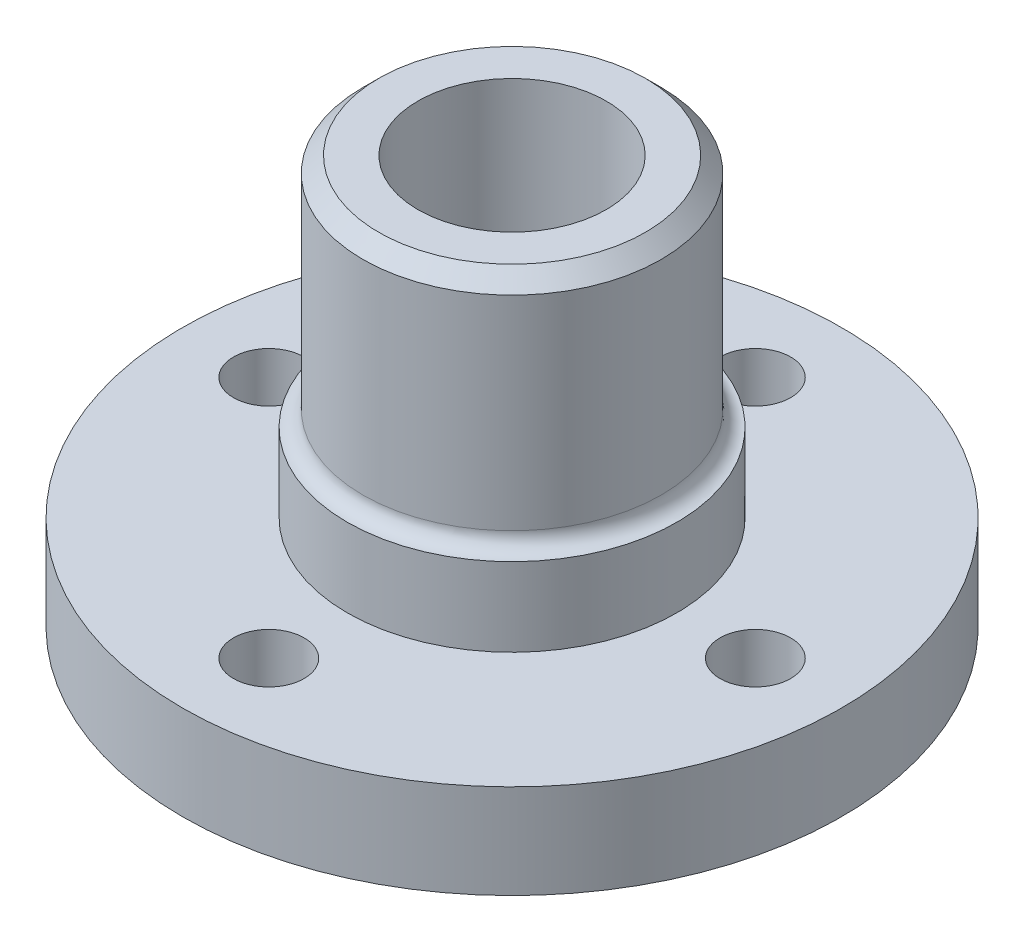
ISO-10303-21;
HEADER;
FILE_DESCRIPTION(('STEP AP214'),'2;1');
FILE_NAME('part.step','',(''),(''),'','','');
FILE_SCHEMA(('AUTOMOTIVE_DESIGN { 1 0 10303 214 1 1 1 1 }'));
ENDSEC;
DATA;
#1=APPLICATION_CONTEXT('core data for automotive mechanical design processes');
#2=APPLICATION_PROTOCOL_DEFINITION('international standard','automotive_design',2000,#1);
#3=PRODUCT_CONTEXT('',#1,'mechanical');
#4=PRODUCT('Part','Part','',(#3));
#5=PRODUCT_RELATED_PRODUCT_CATEGORY('part','',(#4));
#6=PRODUCT_DEFINITION_FORMATION('','',#4);
#7=PRODUCT_DEFINITION_CONTEXT('part definition',#1,'design');
#8=PRODUCT_DEFINITION('design','',#6,#7);
#9=PRODUCT_DEFINITION_SHAPE('','',#8);
#10=(LENGTH_UNIT() NAMED_UNIT(*) SI_UNIT(.MILLI.,.METRE.));
#11=(NAMED_UNIT(*) PLANE_ANGLE_UNIT() SI_UNIT($,.RADIAN.));
#12=(NAMED_UNIT(*) SI_UNIT($,.STERADIAN.) SOLID_ANGLE_UNIT());
#13=UNCERTAINTY_MEASURE_WITH_UNIT(LENGTH_MEASURE(1.E-05),#10,'distance_accuracy_value','');
#14=(GEOMETRIC_REPRESENTATION_CONTEXT(3) GLOBAL_UNCERTAINTY_ASSIGNED_CONTEXT((#13)) GLOBAL_UNIT_ASSIGNED_CONTEXT((#10,
#11,#12)) REPRESENTATION_CONTEXT('',''));
#15=CARTESIAN_POINT('',(0.,0.,0.));
#16=DIRECTION('',(0.,0.,1.));
#17=DIRECTION('',(1.,0.,0.));
#18=AXIS2_PLACEMENT_3D('',#15,#16,#17);
#19=CARTESIAN_POINT('',(0.,7.,0.));
#20=DIRECTION('',(0.,1.,0.));
#21=DIRECTION('',(0.,0.,1.));
#22=AXIS2_PLACEMENT_3D('',#19,#20,#21);
#23=PLANE('',#22);
#24=CARTESIAN_POINT('',(0.,7.,-15.5));
#25=DIRECTION('',(0.,1.,0.));
#26=DIRECTION('',(0.,0.,1.));
#27=AXIS2_PLACEMENT_3D('',#24,#25,#26);
#28=CIRCLE('',#27,2.25);
#29=CARTESIAN_POINT('',(0.,7.,-13.25));
#30=VERTEX_POINT('',#29);
#31=EDGE_CURVE('E62',#30,#30,#28,.T.);
#32=ORIENTED_EDGE('',*,*,#31,.F.);
#33=EDGE_LOOP('',(#32));
#34=FACE_BOUND('',#33,.T.);
#35=CARTESIAN_POINT('',(0.,7.,15.5));
#36=DIRECTION('',(0.,1.,0.));
#37=DIRECTION('',(0.,0.,1.));
#38=AXIS2_PLACEMENT_3D('',#35,#36,#37);
#39=CIRCLE('',#38,2.25);
#40=CARTESIAN_POINT('',(0.,7.,17.75));
#41=VERTEX_POINT('',#40);
#42=EDGE_CURVE('E174',#41,#41,#39,.F.);
#43=ORIENTED_EDGE('',*,*,#42,.T.);
#44=EDGE_LOOP('',(#43));
#45=FACE_BOUND('',#44,.T.);
#46=CARTESIAN_POINT('',(-15.5,7.,0.));
#47=DIRECTION('',(0.,1.,0.));
#48=DIRECTION('',(0.,0.,1.));
#49=AXIS2_PLACEMENT_3D('',#46,#47,#48);
#50=CIRCLE('',#49,2.25);
#51=CARTESIAN_POINT('',(-15.5,7.,2.25000000000001));
#52=VERTEX_POINT('',#51);
#53=EDGE_CURVE('E81',#52,#52,#50,.T.);
#54=ORIENTED_EDGE('',*,*,#53,.F.);
#55=EDGE_LOOP('',(#54));
#56=FACE_BOUND('',#55,.T.);
#57=CARTESIAN_POINT('',(0.,7.,0.));
#58=DIRECTION('',(0.,1.,0.));
#59=DIRECTION('',(0.,0.,1.));
#60=AXIS2_PLACEMENT_3D('',#57,#58,#59);
#61=CIRCLE('',#60,21.);
#62=CARTESIAN_POINT('',(0.,7.,21.));
#63=VERTEX_POINT('',#62);
#64=EDGE_CURVE('E69',#63,#63,#61,.T.);
#65=ORIENTED_EDGE('',*,*,#64,.T.);
#66=EDGE_LOOP('',(#65));
#67=FACE_BOUND('',#66,.T.);
#68=CARTESIAN_POINT('',(0.,7.,0.));
#69=DIRECTION('',(0.,1.,0.));
#70=DIRECTION('',(0.,0.,1.));
#71=AXIS2_PLACEMENT_3D('',#68,#69,#70);
#72=CIRCLE('',#71,10.5);
#73=CARTESIAN_POINT('',(0.,7.,10.5));
#74=VERTEX_POINT('',#73);
#75=EDGE_CURVE('E95',#74,#74,#72,.T.);
#76=ORIENTED_EDGE('',*,*,#75,.F.);
#77=EDGE_LOOP('',(#76));
#78=FACE_BOUND('',#77,.T.);
#79=CARTESIAN_POINT('',(15.5,7.,0.));
#80=DIRECTION('',(0.,1.,0.));
#81=DIRECTION('',(0.,0.,1.));
#82=AXIS2_PLACEMENT_3D('',#79,#80,#81);
#83=CIRCLE('',#82,2.25);
#84=CARTESIAN_POINT('',(15.5,7.,2.24999999999999));
#85=VERTEX_POINT('',#84);
#86=EDGE_CURVE('E171',#85,#85,#83,.F.);
#87=ORIENTED_EDGE('',*,*,#86,.T.);
#88=EDGE_LOOP('',(#87));
#89=FACE_BOUND('',#88,.T.);
#90=ADVANCED_FACE('F41',(#34,#45,#56,#67,#78,#89),#23,.T.);
#91=CARTESIAN_POINT('',(0.,0.999999999999999,0.));
#92=DIRECTION('',(0.,1.,0.));
#93=DIRECTION('',(0.,0.,1.));
#94=AXIS2_PLACEMENT_3D('',#91,#92,#93);
#95=PLANE('',#94);
#96=CARTESIAN_POINT('',(0.,0.999999999999999,-15.5));
#97=DIRECTION('',(0.,1.,0.));
#98=DIRECTION('',(0.,0.,1.));
#99=AXIS2_PLACEMENT_3D('',#96,#97,#98);
#100=CIRCLE('',#99,2.25);
#101=CARTESIAN_POINT('',(0.,0.999999999999999,-13.25));
#102=VERTEX_POINT('',#101);
#103=EDGE_CURVE('E45',#102,#102,#100,.T.);
#104=ORIENTED_EDGE('',*,*,#103,.T.);
#105=EDGE_LOOP('',(#104));
#106=FACE_BOUND('',#105,.T.);
#107=CARTESIAN_POINT('',(-15.5,0.999999999999999,0.));
#108=DIRECTION('',(0.,1.,0.));
#109=DIRECTION('',(0.,0.,1.));
#110=AXIS2_PLACEMENT_3D('',#107,#108,#109);
#111=CIRCLE('',#110,2.25);
#112=CARTESIAN_POINT('',(-15.5,0.999999999999999,2.25000000000001));
#113=VERTEX_POINT('',#112);
#114=EDGE_CURVE('E58',#113,#113,#111,.T.);
#115=ORIENTED_EDGE('',*,*,#114,.T.);
#116=EDGE_LOOP('',(#115));
#117=FACE_BOUND('',#116,.T.);
#118=CARTESIAN_POINT('',(0.,0.999999999999999,0.));
#119=DIRECTION('',(0.,1.,0.));
#120=DIRECTION('',(0.,0.,1.));
#121=AXIS2_PLACEMENT_3D('',#118,#119,#120);
#122=CIRCLE('',#121,11.);
#123=CARTESIAN_POINT('',(0.,0.999999999999999,11.));
#124=VERTEX_POINT('',#123);
#125=EDGE_CURVE('E10',#124,#124,#122,.T.);
#126=ORIENTED_EDGE('',*,*,#125,.T.);
#127=EDGE_LOOP('',(#126));
#128=FACE_BOUND('',#127,.T.);
#129=CARTESIAN_POINT('',(0.,1.,0.));
#130=DIRECTION('',(0.,1.,0.));
#131=DIRECTION('',(0.,0.,1.));
#132=AXIS2_PLACEMENT_3D('',#129,#130,#131);
#133=CIRCLE('',#132,21.);
#134=CARTESIAN_POINT('',(0.,1.,21.));
#135=VERTEX_POINT('',#134);
#136=EDGE_CURVE('E73',#135,#135,#133,.T.);
#137=ORIENTED_EDGE('',*,*,#136,.F.);
#138=EDGE_LOOP('',(#137));
#139=FACE_BOUND('',#138,.T.);
#140=CARTESIAN_POINT('',(0.,0.999999999999999,15.5));
#141=DIRECTION('',(0.,1.,0.));
#142=DIRECTION('',(0.,0.,1.));
#143=AXIS2_PLACEMENT_3D('',#140,#141,#142);
#144=CIRCLE('',#143,2.25);
#145=CARTESIAN_POINT('',(0.,0.999999999999999,17.75));
#146=VERTEX_POINT('',#145);
#147=EDGE_CURVE('E61',#146,#146,#144,.F.);
#148=ORIENTED_EDGE('',*,*,#147,.F.);
#149=EDGE_LOOP('',(#148));
#150=FACE_BOUND('',#149,.T.);
#151=CARTESIAN_POINT('',(15.5,0.999999999999999,0.));
#152=DIRECTION('',(0.,1.,0.));
#153=DIRECTION('',(0.,0.,1.));
#154=AXIS2_PLACEMENT_3D('',#151,#152,#153);
#155=CIRCLE('',#154,2.25);
#156=CARTESIAN_POINT('',(15.5,0.999999999999999,2.24999999999999));
#157=VERTEX_POINT('',#156);
#158=EDGE_CURVE('E64',#157,#157,#155,.F.);
#159=ORIENTED_EDGE('',*,*,#158,.F.);
#160=EDGE_LOOP('',(#159));
#161=FACE_BOUND('',#160,.T.);
#162=ADVANCED_FACE('F123',(#106,#117,#128,#139,#150,#161),#95,.F.);
#163=CARTESIAN_POINT('',(0.,27.,0.));
#164=DIRECTION('',(0.,1.,0.));
#165=DIRECTION('',(0.,0.,1.));
#166=AXIS2_PLACEMENT_3D('',#163,#164,#165);
#167=CYLINDRICAL_SURFACE('',#166,10.5);
#168=ORIENTED_EDGE('',*,*,#75,.T.);
#169=EDGE_LOOP('',(#168));
#170=FACE_BOUND('',#169,.T.);
#171=CARTESIAN_POINT('',(0.,12.,0.));
#172=DIRECTION('',(0.,1.,0.));
#173=DIRECTION('',(0.,0.,1.));
#174=AXIS2_PLACEMENT_3D('',#171,#172,#173);
#175=CIRCLE('',#174,10.5);
#176=CARTESIAN_POINT('',(0.,12.,10.5));
#177=VERTEX_POINT('',#176);
#178=EDGE_CURVE('E92',#177,#177,#175,.T.);
#179=ORIENTED_EDGE('',*,*,#178,.F.);
#180=EDGE_LOOP('',(#179));
#181=FACE_BOUND('',#180,.T.);
#182=ADVANCED_FACE('F129',(#170,#181),#167,.T.);
#183=CARTESIAN_POINT('',(0.,27.,0.));
#184=DIRECTION('',(0.,1.,0.));
#185=DIRECTION('',(0.,0.,1.));
#186=AXIS2_PLACEMENT_3D('',#183,#184,#185);
#187=CYLINDRICAL_SURFACE('',#186,9.5);
#188=CARTESIAN_POINT('',(0.,26.,0.));
#189=DIRECTION('',(0.,-1.,0.));
#190=DIRECTION('',(0.,0.,-1.));
#191=AXIS2_PLACEMENT_3D('',#188,#189,#190);
#192=CIRCLE('',#191,9.5);
#193=CARTESIAN_POINT('',(0.,26.,-9.5));
#194=VERTEX_POINT('',#193);
#195=EDGE_CURVE('E49',#194,#194,#192,.T.);
#196=ORIENTED_EDGE('',*,*,#195,.T.);
#197=EDGE_LOOP('',(#196));
#198=FACE_BOUND('',#197,.T.);
#199=CARTESIAN_POINT('',(0.,13.,0.));
#200=DIRECTION('',(0.,1.,0.));
#201=DIRECTION('',(0.,0.,1.));
#202=AXIS2_PLACEMENT_3D('',#199,#200,#201);
#203=CIRCLE('',#202,9.5);
#204=CARTESIAN_POINT('',(0.,13.,9.5));
#205=VERTEX_POINT('',#204);
#206=EDGE_CURVE('E98',#205,#205,#203,.T.);
#207=ORIENTED_EDGE('',*,*,#206,.T.);
#208=EDGE_LOOP('',(#207));
#209=FACE_BOUND('',#208,.T.);
#210=ADVANCED_FACE('F136',(#198,#209),#187,.T.);
#211=CARTESIAN_POINT('',(0.,27.,0.));
#212=DIRECTION('',(0.,-1.,0.));
#213=DIRECTION('',(0.,0.,-1.));
#214=AXIS2_PLACEMENT_3D('',#211,#212,#213);
#215=PLANE('',#214);
#216=CARTESIAN_POINT('',(0.,27.,0.));
#217=DIRECTION('',(0.,-1.,0.));
#218=DIRECTION('',(0.,0.,-1.));
#219=AXIS2_PLACEMENT_3D('',#216,#217,#218);
#220=CIRCLE('',#219,8.5);
#221=CARTESIAN_POINT('',(0.,27.,-8.5));
#222=VERTEX_POINT('',#221);
#223=EDGE_CURVE('E54',#222,#222,#220,.F.);
#224=ORIENTED_EDGE('',*,*,#223,.T.);
#225=EDGE_LOOP('',(#224));
#226=FACE_BOUND('',#225,.T.);
#227=CARTESIAN_POINT('',(0.,27.,0.));
#228=DIRECTION('',(0.,1.,0.));
#229=DIRECTION('',(0.,0.,1.));
#230=AXIS2_PLACEMENT_3D('',#227,#228,#229);
#231=CIRCLE('',#230,6.);
#232=CARTESIAN_POINT('',(0.,27.,6.));
#233=VERTEX_POINT('',#232);
#234=EDGE_CURVE('E89',#233,#233,#231,.T.);
#235=ORIENTED_EDGE('',*,*,#234,.F.);
#236=EDGE_LOOP('',(#235));
#237=FACE_BOUND('',#236,.T.);
#238=ADVANCED_FACE('F103',(#226,#237),#215,.F.);
#239=CARTESIAN_POINT('',(0.,27.,0.));
#240=DIRECTION('',(0.,1.,0.));
#241=DIRECTION('',(0.,0.,1.));
#242=AXIS2_PLACEMENT_3D('',#239,#240,#241);
#243=CYLINDRICAL_SURFACE('',#242,6.);
#244=CARTESIAN_POINT('',(0.,0.,0.));
#245=DIRECTION('',(0.,1.,0.));
#246=DIRECTION('',(0.,0.,1.));
#247=AXIS2_PLACEMENT_3D('',#244,#245,#246);
#248=CIRCLE('',#247,6.);
#249=CARTESIAN_POINT('',(0.,0.,6.));
#250=VERTEX_POINT('',#249);
#251=EDGE_CURVE('E86',#250,#250,#248,.T.);
#252=ORIENTED_EDGE('',*,*,#251,.F.);
#253=EDGE_LOOP('',(#252));
#254=FACE_BOUND('',#253,.T.);
#255=ORIENTED_EDGE('',*,*,#234,.T.);
#256=EDGE_LOOP('',(#255));
#257=FACE_BOUND('',#256,.T.);
#258=ADVANCED_FACE('F142',(#254,#257),#243,.F.);
#259=CARTESIAN_POINT('',(0.,0.,0.));
#260=DIRECTION('',(0.,1.,0.));
#261=DIRECTION('',(0.,0.,1.));
#262=AXIS2_PLACEMENT_3D('',#259,#260,#261);
#263=PLANE('',#262);
#264=CARTESIAN_POINT('',(0.,0.,0.));
#265=DIRECTION('',(0.,1.,0.));
#266=DIRECTION('',(0.,0.,1.));
#267=AXIS2_PLACEMENT_3D('',#264,#265,#266);
#268=CIRCLE('',#267,10.);
#269=CARTESIAN_POINT('',(0.,0.,10.));
#270=VERTEX_POINT('',#269);
#271=EDGE_CURVE('E78',#270,#270,#268,.T.);
#272=ORIENTED_EDGE('',*,*,#271,.F.);
#273=EDGE_LOOP('',(#272));
#274=FACE_BOUND('',#273,.T.);
#275=ORIENTED_EDGE('',*,*,#251,.T.);
#276=EDGE_LOOP('',(#275));
#277=FACE_BOUND('',#276,.T.);
#278=ADVANCED_FACE('F145',(#274,#277),#263,.F.);
#279=CARTESIAN_POINT('',(0.,27.,0.));
#280=DIRECTION('',(0.,1.,0.));
#281=DIRECTION('',(0.,0.,1.));
#282=AXIS2_PLACEMENT_3D('',#279,#280,#281);
#283=CYLINDRICAL_SURFACE('',#282,21.);
#284=ORIENTED_EDGE('',*,*,#64,.F.);
#285=EDGE_LOOP('',(#284));
#286=FACE_BOUND('',#285,.T.);
#287=ORIENTED_EDGE('',*,*,#136,.T.);
#288=EDGE_LOOP('',(#287));
#289=FACE_BOUND('',#288,.T.);
#290=ADVANCED_FACE('F117',(#286,#289),#283,.T.);
#291=CARTESIAN_POINT('',(0.,13.,0.));
#292=DIRECTION('',(0.,1.,0.));
#293=DIRECTION('',(0.,0.,1.));
#294=AXIS2_PLACEMENT_3D('',#291,#292,#293);
#295=TOROIDAL_SURFACE('',#294,10.5,1.);
#296=ORIENTED_EDGE('',*,*,#178,.T.);
#297=EDGE_LOOP('',(#296));
#298=FACE_BOUND('',#297,.T.);
#299=ORIENTED_EDGE('',*,*,#206,.F.);
#300=EDGE_LOOP('',(#299));
#301=FACE_BOUND('',#300,.T.);
#302=ADVANCED_FACE('F108',(#298,#301),#295,.F.);
#303=CARTESIAN_POINT('',(0.,27.,0.));
#304=DIRECTION('',(0.,-1.,0.));
#305=DIRECTION('',(0.,0.,-1.));
#306=AXIS2_PLACEMENT_3D('',#303,#304,#305);
#307=CONICAL_SURFACE('',#306,8.5,0.785398163397445);
#308=ORIENTED_EDGE('',*,*,#195,.F.);
#309=EDGE_LOOP('',(#308));
#310=FACE_BOUND('',#309,.T.);
#311=ORIENTED_EDGE('',*,*,#223,.F.);
#312=EDGE_LOOP('',(#311));
#313=FACE_BOUND('',#312,.T.);
#314=ADVANCED_FACE('F106',(#310,#313),#307,.T.);
#315=CARTESIAN_POINT('',(0.,0.,0.));
#316=DIRECTION('',(0.,1.,0.));
#317=DIRECTION('',(0.,0.,1.));
#318=AXIS2_PLACEMENT_3D('',#315,#316,#317);
#319=TOROIDAL_SURFACE('',#318,11.,1.);
#320=ORIENTED_EDGE('',*,*,#271,.T.);
#321=EDGE_LOOP('',(#320));
#322=FACE_BOUND('',#321,.T.);
#323=ORIENTED_EDGE('',*,*,#125,.F.);
#324=EDGE_LOOP('',(#323));
#325=FACE_BOUND('',#324,.T.);
#326=ADVANCED_FACE('F43',(#322,#325),#319,.F.);
#327=CARTESIAN_POINT('',(-15.5,0.,0.));
#328=DIRECTION('',(0.,1.,0.));
#329=DIRECTION('',(0.,0.,1.));
#330=AXIS2_PLACEMENT_3D('',#327,#328,#329);
#331=CYLINDRICAL_SURFACE('',#330,2.25);
#332=CARTESIAN_POINT('',(-15.5,7.,2.25000000000001));
#333=CARTESIAN_POINT('',(-15.5,6.9375,2.25000000000001));
#334=CARTESIAN_POINT('',(-15.5,6.875,2.25000000000001));
#335=CARTESIAN_POINT('',(-15.5,6.75,2.25000000000001));
#336=CARTESIAN_POINT('',(-15.5,6.6875,2.25000000000001));
#337=CARTESIAN_POINT('',(-15.5,6.5625,2.25000000000001));
#338=CARTESIAN_POINT('',(-15.5,6.5,2.25000000000001));
#339=CARTESIAN_POINT('',(-15.5,6.375,2.25000000000001));
#340=CARTESIAN_POINT('',(-15.5,6.3125,2.25000000000001));
#341=CARTESIAN_POINT('',(-15.5,6.1875,2.25000000000001));
#342=CARTESIAN_POINT('',(-15.5,6.125,2.25000000000001));
#343=CARTESIAN_POINT('',(-15.5,6.,2.25000000000001));
#344=CARTESIAN_POINT('',(-15.5,5.9375,2.25000000000001));
#345=CARTESIAN_POINT('',(-15.5,5.8125,2.25000000000001));
#346=CARTESIAN_POINT('',(-15.5,5.75,2.25000000000001));
#347=CARTESIAN_POINT('',(-15.5,5.625,2.25000000000001));
#348=CARTESIAN_POINT('',(-15.5,5.5625,2.25000000000001));
#349=CARTESIAN_POINT('',(-15.5,5.4375,2.25000000000001));
#350=CARTESIAN_POINT('',(-15.5,5.375,2.25000000000001));
#351=CARTESIAN_POINT('',(-15.5,5.25,2.25000000000001));
#352=CARTESIAN_POINT('',(-15.5,5.1875,2.25000000000001));
#353=CARTESIAN_POINT('',(-15.5,5.0625,2.25000000000001));
#354=CARTESIAN_POINT('',(-15.5,5.,2.25000000000001));
#355=CARTESIAN_POINT('',(-15.5,4.875,2.25000000000001));
#356=CARTESIAN_POINT('',(-15.5,4.8125,2.25000000000001));
#357=CARTESIAN_POINT('',(-15.5,4.6875,2.25000000000001));
#358=CARTESIAN_POINT('',(-15.5,4.625,2.25000000000001));
#359=CARTESIAN_POINT('',(-15.5,4.5,2.25000000000001));
#360=CARTESIAN_POINT('',(-15.5,4.4375,2.25000000000001));
#361=CARTESIAN_POINT('',(-15.5,4.3125,2.25000000000001));
#362=CARTESIAN_POINT('',(-15.5,4.25,2.25000000000001));
#363=CARTESIAN_POINT('',(-15.5,4.125,2.25000000000001));
#364=CARTESIAN_POINT('',(-15.5,4.0625,2.25000000000001));
#365=CARTESIAN_POINT('',(-15.5,3.9375,2.25000000000001));
#366=CARTESIAN_POINT('',(-15.5,3.875,2.25000000000001));
#367=CARTESIAN_POINT('',(-15.5,3.75,2.25000000000001));
#368=CARTESIAN_POINT('',(-15.5,3.6875,2.25000000000001));
#369=CARTESIAN_POINT('',(-15.5,3.5625,2.25000000000001));
#370=CARTESIAN_POINT('',(-15.5,3.5,2.25000000000001));
#371=CARTESIAN_POINT('',(-15.5,3.375,2.25000000000001));
#372=CARTESIAN_POINT('',(-15.5,3.3125,2.25000000000001));
#373=CARTESIAN_POINT('',(-15.5,3.1875,2.25000000000001));
#374=CARTESIAN_POINT('',(-15.5,3.125,2.25000000000001));
#375=CARTESIAN_POINT('',(-15.5,3.,2.25000000000001));
#376=CARTESIAN_POINT('',(-15.5,2.9375,2.25000000000001));
#377=CARTESIAN_POINT('',(-15.5,2.8125,2.25000000000001));
#378=CARTESIAN_POINT('',(-15.5,2.75,2.25000000000001));
#379=CARTESIAN_POINT('',(-15.5,2.625,2.25000000000001));
#380=CARTESIAN_POINT('',(-15.5,2.5625,2.25000000000001));
#381=CARTESIAN_POINT('',(-15.5,2.4375,2.25000000000001));
#382=CARTESIAN_POINT('',(-15.5,2.375,2.25000000000001));
#383=CARTESIAN_POINT('',(-15.5,2.25,2.25000000000001));
#384=CARTESIAN_POINT('',(-15.5,2.1875,2.25000000000001));
#385=CARTESIAN_POINT('',(-15.5,2.0625,2.25000000000001));
#386=CARTESIAN_POINT('',(-15.5,2.,2.25000000000001));
#387=CARTESIAN_POINT('',(-15.5,1.875,2.25000000000001));
#388=CARTESIAN_POINT('',(-15.5,1.8125,2.25000000000001));
#389=CARTESIAN_POINT('',(-15.5,1.6875,2.25000000000001));
#390=CARTESIAN_POINT('',(-15.5,1.625,2.25000000000001));
#391=CARTESIAN_POINT('',(-15.5,1.5,2.25000000000001));
#392=CARTESIAN_POINT('',(-15.5,1.4375,2.25000000000001));
#393=CARTESIAN_POINT('',(-15.5,1.3125,2.25000000000001));
#394=CARTESIAN_POINT('',(-15.5,1.25,2.25000000000001));
#395=CARTESIAN_POINT('',(-15.5,1.125,2.25000000000001));
#396=CARTESIAN_POINT('',(-15.5,1.0625,2.25000000000001));
#397=CARTESIAN_POINT('',(-15.5,0.999999999999999,2.25000000000001));
#398=B_SPLINE_CURVE_WITH_KNOTS('',3,(#332,#333,#334,#335,#336,#337,#338,#339,#340,#341,#342,
#343,#344,#345,#346,#347,#348,#349,#350,#351,#352,#353,#354,#355,#356,#357,#358,#359,#360,#361,
#362,#363,#364,#365,#366,#367,#368,#369,#370,#371,#372,#373,#374,#375,#376,#377,#378,#379,#380,
#381,#382,#383,#384,#385,#386,#387,#388,#389,#390,#391,#392,#393,#394,#395,#396,#397),
.UNSPECIFIED.,.F.,.F.,(4,2,2,2,2,2,2,2,2,2,2,2,2,2,2,2,2,2,2,2,2,2,2,2,2,2,2,2,2,2,2,2,4),(0.,
0.1875,0.375,0.5625,0.75,0.9375,1.125,1.3125,1.5,1.6875,1.875,2.0625,2.25,2.4375,2.625,2.8125,
3.,3.1875,3.375,3.5625,3.75,3.9375,4.125,4.3125,4.5,4.6875,4.875,5.0625,5.25,5.4375,5.625,
5.8125,6.),.UNSPECIFIED.);
#399=EDGE_CURVE('BSEAM114',#52,#113,#398,.T.);
#400=ORIENTED_EDGE('',*,*,#53,.T.);
#401=ORIENTED_EDGE('',*,*,#114,.F.);
#402=ORIENTED_EDGE('',*,*,#399,.T.);
#403=ORIENTED_EDGE('',*,*,#399,.F.);
#404=EDGE_LOOP('',(#400,#402,#401,#403));
#405=FACE_BOUND('',#404,.T.);
#406=ADVANCED_FACE('F114',(#405),#331,.F.);
#407=CARTESIAN_POINT('',(0.,0.,15.5));
#408=DIRECTION('',(0.,1.,0.));
#409=DIRECTION('',(0.,0.,1.));
#410=AXIS2_PLACEMENT_3D('',#407,#408,#409);
#411=CYLINDRICAL_SURFACE('',#410,2.25);
#412=CARTESIAN_POINT('',(0.,7.,17.75));
#413=CARTESIAN_POINT('',(0.,6.9375,17.75));
#414=CARTESIAN_POINT('',(0.,6.875,17.75));
#415=CARTESIAN_POINT('',(0.,6.75,17.75));
#416=CARTESIAN_POINT('',(0.,6.6875,17.75));
#417=CARTESIAN_POINT('',(0.,6.5625,17.75));
#418=CARTESIAN_POINT('',(0.,6.5,17.75));
#419=CARTESIAN_POINT('',(0.,6.375,17.75));
#420=CARTESIAN_POINT('',(0.,6.3125,17.75));
#421=CARTESIAN_POINT('',(0.,6.1875,17.75));
#422=CARTESIAN_POINT('',(0.,6.125,17.75));
#423=CARTESIAN_POINT('',(0.,6.,17.75));
#424=CARTESIAN_POINT('',(0.,5.9375,17.75));
#425=CARTESIAN_POINT('',(0.,5.8125,17.75));
#426=CARTESIAN_POINT('',(0.,5.75,17.75));
#427=CARTESIAN_POINT('',(0.,5.625,17.75));
#428=CARTESIAN_POINT('',(0.,5.5625,17.75));
#429=CARTESIAN_POINT('',(0.,5.4375,17.75));
#430=CARTESIAN_POINT('',(0.,5.375,17.75));
#431=CARTESIAN_POINT('',(0.,5.25,17.75));
#432=CARTESIAN_POINT('',(0.,5.1875,17.75));
#433=CARTESIAN_POINT('',(0.,5.0625,17.75));
#434=CARTESIAN_POINT('',(0.,5.,17.75));
#435=CARTESIAN_POINT('',(0.,4.875,17.75));
#436=CARTESIAN_POINT('',(0.,4.8125,17.75));
#437=CARTESIAN_POINT('',(0.,4.6875,17.75));
#438=CARTESIAN_POINT('',(0.,4.625,17.75));
#439=CARTESIAN_POINT('',(0.,4.5,17.75));
#440=CARTESIAN_POINT('',(0.,4.4375,17.75));
#441=CARTESIAN_POINT('',(0.,4.3125,17.75));
#442=CARTESIAN_POINT('',(0.,4.25,17.75));
#443=CARTESIAN_POINT('',(0.,4.125,17.75));
#444=CARTESIAN_POINT('',(0.,4.0625,17.75));
#445=CARTESIAN_POINT('',(0.,3.9375,17.75));
#446=CARTESIAN_POINT('',(0.,3.875,17.75));
#447=CARTESIAN_POINT('',(0.,3.75,17.75));
#448=CARTESIAN_POINT('',(0.,3.6875,17.75));
#449=CARTESIAN_POINT('',(0.,3.5625,17.75));
#450=CARTESIAN_POINT('',(0.,3.5,17.75));
#451=CARTESIAN_POINT('',(0.,3.375,17.75));
#452=CARTESIAN_POINT('',(0.,3.3125,17.75));
#453=CARTESIAN_POINT('',(0.,3.1875,17.75));
#454=CARTESIAN_POINT('',(0.,3.125,17.75));
#455=CARTESIAN_POINT('',(0.,3.,17.75));
#456=CARTESIAN_POINT('',(0.,2.9375,17.75));
#457=CARTESIAN_POINT('',(0.,2.8125,17.75));
#458=CARTESIAN_POINT('',(0.,2.75,17.75));
#459=CARTESIAN_POINT('',(0.,2.625,17.75));
#460=CARTESIAN_POINT('',(0.,2.5625,17.75));
#461=CARTESIAN_POINT('',(0.,2.4375,17.75));
#462=CARTESIAN_POINT('',(0.,2.375,17.75));
#463=CARTESIAN_POINT('',(0.,2.25,17.75));
#464=CARTESIAN_POINT('',(0.,2.1875,17.75));
#465=CARTESIAN_POINT('',(0.,2.0625,17.75));
#466=CARTESIAN_POINT('',(0.,2.,17.75));
#467=CARTESIAN_POINT('',(0.,1.875,17.75));
#468=CARTESIAN_POINT('',(0.,1.8125,17.75));
#469=CARTESIAN_POINT('',(0.,1.6875,17.75));
#470=CARTESIAN_POINT('',(0.,1.625,17.75));
#471=CARTESIAN_POINT('',(0.,1.5,17.75));
#472=CARTESIAN_POINT('',(0.,1.4375,17.75));
#473=CARTESIAN_POINT('',(0.,1.3125,17.75));
#474=CARTESIAN_POINT('',(0.,1.25,17.75));
#475=CARTESIAN_POINT('',(0.,1.125,17.75));
#476=CARTESIAN_POINT('',(0.,1.0625,17.75));
#477=CARTESIAN_POINT('',(0.,0.999999999999999,17.75));
#478=B_SPLINE_CURVE_WITH_KNOTS('',3,(#412,#413,#414,#415,#416,#417,#418,#419,#420,#421,#422,
#423,#424,#425,#426,#427,#428,#429,#430,#431,#432,#433,#434,#435,#436,#437,#438,#439,#440,#441,
#442,#443,#444,#445,#446,#447,#448,#449,#450,#451,#452,#453,#454,#455,#456,#457,#458,#459,#460,
#461,#462,#463,#464,#465,#466,#467,#468,#469,#470,#471,#472,#473,#474,#475,#476,#477),
.UNSPECIFIED.,.F.,.F.,(4,2,2,2,2,2,2,2,2,2,2,2,2,2,2,2,2,2,2,2,2,2,2,2,2,2,2,2,2,2,2,2,4),(0.,
0.1875,0.375,0.5625,0.75,0.9375,1.125,1.3125,1.5,1.6875,1.875,2.0625,2.25,2.4375,2.625,2.8125,
3.,3.1875,3.375,3.5625,3.75,3.9375,4.125,4.3125,4.5,4.6875,4.875,5.0625,5.25,5.4375,5.625,
5.8125,6.),.UNSPECIFIED.);
#479=EDGE_CURVE('BSEAM155',#41,#146,#478,.T.);
#480=ORIENTED_EDGE('',*,*,#42,.F.);
#481=ORIENTED_EDGE('',*,*,#147,.T.);
#482=ORIENTED_EDGE('',*,*,#479,.T.);
#483=ORIENTED_EDGE('',*,*,#479,.F.);
#484=EDGE_LOOP('',(#480,#482,#481,#483));
#485=FACE_BOUND('',#484,.T.);
#486=ADVANCED_FACE('F155',(#485),#411,.F.);
#487=CARTESIAN_POINT('',(15.5,0.,0.));
#488=DIRECTION('',(0.,1.,0.));
#489=DIRECTION('',(0.,0.,1.));
#490=AXIS2_PLACEMENT_3D('',#487,#488,#489);
#491=CYLINDRICAL_SURFACE('',#490,2.25);
#492=CARTESIAN_POINT('',(15.5,7.,2.24999999999999));
#493=CARTESIAN_POINT('',(15.5,6.9375,2.24999999999999));
#494=CARTESIAN_POINT('',(15.5,6.875,2.24999999999999));
#495=CARTESIAN_POINT('',(15.5,6.75,2.24999999999999));
#496=CARTESIAN_POINT('',(15.5,6.6875,2.24999999999999));
#497=CARTESIAN_POINT('',(15.5,6.5625,2.24999999999999));
#498=CARTESIAN_POINT('',(15.5,6.5,2.24999999999999));
#499=CARTESIAN_POINT('',(15.5,6.375,2.24999999999999));
#500=CARTESIAN_POINT('',(15.5,6.3125,2.24999999999999));
#501=CARTESIAN_POINT('',(15.5,6.1875,2.24999999999999));
#502=CARTESIAN_POINT('',(15.5,6.125,2.24999999999999));
#503=CARTESIAN_POINT('',(15.5,6.,2.24999999999999));
#504=CARTESIAN_POINT('',(15.5,5.9375,2.24999999999999));
#505=CARTESIAN_POINT('',(15.5,5.8125,2.24999999999999));
#506=CARTESIAN_POINT('',(15.5,5.75,2.24999999999999));
#507=CARTESIAN_POINT('',(15.5,5.625,2.24999999999999));
#508=CARTESIAN_POINT('',(15.5,5.5625,2.24999999999999));
#509=CARTESIAN_POINT('',(15.5,5.4375,2.24999999999999));
#510=CARTESIAN_POINT('',(15.5,5.375,2.24999999999999));
#511=CARTESIAN_POINT('',(15.5,5.25,2.24999999999999));
#512=CARTESIAN_POINT('',(15.5,5.1875,2.24999999999999));
#513=CARTESIAN_POINT('',(15.5,5.0625,2.24999999999999));
#514=CARTESIAN_POINT('',(15.5,5.,2.24999999999999));
#515=CARTESIAN_POINT('',(15.5,4.875,2.24999999999999));
#516=CARTESIAN_POINT('',(15.5,4.8125,2.24999999999999));
#517=CARTESIAN_POINT('',(15.5,4.6875,2.24999999999999));
#518=CARTESIAN_POINT('',(15.5,4.625,2.24999999999999));
#519=CARTESIAN_POINT('',(15.5,4.5,2.24999999999999));
#520=CARTESIAN_POINT('',(15.5,4.4375,2.24999999999999));
#521=CARTESIAN_POINT('',(15.5,4.3125,2.24999999999999));
#522=CARTESIAN_POINT('',(15.5,4.25,2.24999999999999));
#523=CARTESIAN_POINT('',(15.5,4.125,2.24999999999999));
#524=CARTESIAN_POINT('',(15.5,4.0625,2.24999999999999));
#525=CARTESIAN_POINT('',(15.5,3.9375,2.24999999999999));
#526=CARTESIAN_POINT('',(15.5,3.875,2.24999999999999));
#527=CARTESIAN_POINT('',(15.5,3.75,2.24999999999999));
#528=CARTESIAN_POINT('',(15.5,3.6875,2.24999999999999));
#529=CARTESIAN_POINT('',(15.5,3.5625,2.24999999999999));
#530=CARTESIAN_POINT('',(15.5,3.5,2.24999999999999));
#531=CARTESIAN_POINT('',(15.5,3.375,2.24999999999999));
#532=CARTESIAN_POINT('',(15.5,3.3125,2.24999999999999));
#533=CARTESIAN_POINT('',(15.5,3.1875,2.24999999999999));
#534=CARTESIAN_POINT('',(15.5,3.125,2.24999999999999));
#535=CARTESIAN_POINT('',(15.5,3.,2.24999999999999));
#536=CARTESIAN_POINT('',(15.5,2.9375,2.24999999999999));
#537=CARTESIAN_POINT('',(15.5,2.8125,2.24999999999999));
#538=CARTESIAN_POINT('',(15.5,2.75,2.24999999999999));
#539=CARTESIAN_POINT('',(15.5,2.625,2.24999999999999));
#540=CARTESIAN_POINT('',(15.5,2.5625,2.24999999999999));
#541=CARTESIAN_POINT('',(15.5,2.4375,2.24999999999999));
#542=CARTESIAN_POINT('',(15.5,2.375,2.24999999999999));
#543=CARTESIAN_POINT('',(15.5,2.25,2.24999999999999));
#544=CARTESIAN_POINT('',(15.5,2.1875,2.24999999999999));
#545=CARTESIAN_POINT('',(15.5,2.0625,2.24999999999999));
#546=CARTESIAN_POINT('',(15.5,2.,2.24999999999999));
#547=CARTESIAN_POINT('',(15.5,1.875,2.24999999999999));
#548=CARTESIAN_POINT('',(15.5,1.8125,2.24999999999999));
#549=CARTESIAN_POINT('',(15.5,1.6875,2.24999999999999));
#550=CARTESIAN_POINT('',(15.5,1.625,2.24999999999999));
#551=CARTESIAN_POINT('',(15.5,1.5,2.24999999999999));
#552=CARTESIAN_POINT('',(15.5,1.4375,2.24999999999999));
#553=CARTESIAN_POINT('',(15.5,1.3125,2.24999999999999));
#554=CARTESIAN_POINT('',(15.5,1.25,2.24999999999999));
#555=CARTESIAN_POINT('',(15.5,1.125,2.24999999999999));
#556=CARTESIAN_POINT('',(15.5,1.0625,2.24999999999999));
#557=CARTESIAN_POINT('',(15.5,0.999999999999999,2.24999999999999));
#558=B_SPLINE_CURVE_WITH_KNOTS('',3,(#492,#493,#494,#495,#496,#497,#498,#499,#500,#501,#502,
#503,#504,#505,#506,#507,#508,#509,#510,#511,#512,#513,#514,#515,#516,#517,#518,#519,#520,#521,
#522,#523,#524,#525,#526,#527,#528,#529,#530,#531,#532,#533,#534,#535,#536,#537,#538,#539,#540,
#541,#542,#543,#544,#545,#546,#547,#548,#549,#550,#551,#552,#553,#554,#555,#556,#557),
.UNSPECIFIED.,.F.,.F.,(4,2,2,2,2,2,2,2,2,2,2,2,2,2,2,2,2,2,2,2,2,2,2,2,2,2,2,2,2,2,2,2,4),(0.,
0.1875,0.375,0.5625,0.75,0.9375,1.125,1.3125,1.5,1.6875,1.875,2.0625,2.25,2.4375,2.625,2.8125,
3.,3.1875,3.375,3.5625,3.75,3.9375,4.125,4.3125,4.5,4.6875,4.875,5.0625,5.25,5.4375,5.625,
5.8125,6.),.UNSPECIFIED.);
#559=EDGE_CURVE('BSEAM159',#85,#157,#558,.T.);
#560=ORIENTED_EDGE('',*,*,#86,.F.);
#561=ORIENTED_EDGE('',*,*,#158,.T.);
#562=ORIENTED_EDGE('',*,*,#559,.T.);
#563=ORIENTED_EDGE('',*,*,#559,.F.);
#564=EDGE_LOOP('',(#560,#562,#561,#563));
#565=FACE_BOUND('',#564,.T.);
#566=ADVANCED_FACE('F159',(#565),#491,.F.);
#567=CARTESIAN_POINT('',(0.,0.,-15.5));
#568=DIRECTION('',(0.,1.,0.));
#569=DIRECTION('',(0.,0.,1.));
#570=AXIS2_PLACEMENT_3D('',#567,#568,#569);
#571=CYLINDRICAL_SURFACE('',#570,2.25);
#572=CARTESIAN_POINT('',(0.,7.,-13.25));
#573=CARTESIAN_POINT('',(0.,6.9375,-13.25));
#574=CARTESIAN_POINT('',(0.,6.875,-13.25));
#575=CARTESIAN_POINT('',(0.,6.75,-13.25));
#576=CARTESIAN_POINT('',(0.,6.6875,-13.25));
#577=CARTESIAN_POINT('',(0.,6.5625,-13.25));
#578=CARTESIAN_POINT('',(0.,6.5,-13.25));
#579=CARTESIAN_POINT('',(0.,6.375,-13.25));
#580=CARTESIAN_POINT('',(0.,6.3125,-13.25));
#581=CARTESIAN_POINT('',(0.,6.1875,-13.25));
#582=CARTESIAN_POINT('',(0.,6.125,-13.25));
#583=CARTESIAN_POINT('',(0.,6.,-13.25));
#584=CARTESIAN_POINT('',(0.,5.9375,-13.25));
#585=CARTESIAN_POINT('',(0.,5.8125,-13.25));
#586=CARTESIAN_POINT('',(0.,5.75,-13.25));
#587=CARTESIAN_POINT('',(0.,5.625,-13.25));
#588=CARTESIAN_POINT('',(0.,5.5625,-13.25));
#589=CARTESIAN_POINT('',(0.,5.4375,-13.25));
#590=CARTESIAN_POINT('',(0.,5.375,-13.25));
#591=CARTESIAN_POINT('',(0.,5.25,-13.25));
#592=CARTESIAN_POINT('',(0.,5.1875,-13.25));
#593=CARTESIAN_POINT('',(0.,5.0625,-13.25));
#594=CARTESIAN_POINT('',(0.,5.,-13.25));
#595=CARTESIAN_POINT('',(0.,4.875,-13.25));
#596=CARTESIAN_POINT('',(0.,4.8125,-13.25));
#597=CARTESIAN_POINT('',(0.,4.6875,-13.25));
#598=CARTESIAN_POINT('',(0.,4.625,-13.25));
#599=CARTESIAN_POINT('',(0.,4.5,-13.25));
#600=CARTESIAN_POINT('',(0.,4.4375,-13.25));
#601=CARTESIAN_POINT('',(0.,4.3125,-13.25));
#602=CARTESIAN_POINT('',(0.,4.25,-13.25));
#603=CARTESIAN_POINT('',(0.,4.125,-13.25));
#604=CARTESIAN_POINT('',(0.,4.0625,-13.25));
#605=CARTESIAN_POINT('',(0.,3.9375,-13.25));
#606=CARTESIAN_POINT('',(0.,3.875,-13.25));
#607=CARTESIAN_POINT('',(0.,3.75,-13.25));
#608=CARTESIAN_POINT('',(0.,3.6875,-13.25));
#609=CARTESIAN_POINT('',(0.,3.5625,-13.25));
#610=CARTESIAN_POINT('',(0.,3.5,-13.25));
#611=CARTESIAN_POINT('',(0.,3.375,-13.25));
#612=CARTESIAN_POINT('',(0.,3.3125,-13.25));
#613=CARTESIAN_POINT('',(0.,3.1875,-13.25));
#614=CARTESIAN_POINT('',(0.,3.125,-13.25));
#615=CARTESIAN_POINT('',(0.,3.,-13.25));
#616=CARTESIAN_POINT('',(0.,2.9375,-13.25));
#617=CARTESIAN_POINT('',(0.,2.8125,-13.25));
#618=CARTESIAN_POINT('',(0.,2.75,-13.25));
#619=CARTESIAN_POINT('',(0.,2.625,-13.25));
#620=CARTESIAN_POINT('',(0.,2.5625,-13.25));
#621=CARTESIAN_POINT('',(0.,2.4375,-13.25));
#622=CARTESIAN_POINT('',(0.,2.375,-13.25));
#623=CARTESIAN_POINT('',(0.,2.25,-13.25));
#624=CARTESIAN_POINT('',(0.,2.1875,-13.25));
#625=CARTESIAN_POINT('',(0.,2.0625,-13.25));
#626=CARTESIAN_POINT('',(0.,2.,-13.25));
#627=CARTESIAN_POINT('',(0.,1.875,-13.25));
#628=CARTESIAN_POINT('',(0.,1.8125,-13.25));
#629=CARTESIAN_POINT('',(0.,1.6875,-13.25));
#630=CARTESIAN_POINT('',(0.,1.625,-13.25));
#631=CARTESIAN_POINT('',(0.,1.5,-13.25));
#632=CARTESIAN_POINT('',(0.,1.4375,-13.25));
#633=CARTESIAN_POINT('',(0.,1.3125,-13.25));
#634=CARTESIAN_POINT('',(0.,1.25,-13.25));
#635=CARTESIAN_POINT('',(0.,1.125,-13.25));
#636=CARTESIAN_POINT('',(0.,1.0625,-13.25));
#637=CARTESIAN_POINT('',(0.,0.999999999999999,-13.25));
#638=B_SPLINE_CURVE_WITH_KNOTS('',3,(#572,#573,#574,#575,#576,#577,#578,#579,#580,#581,#582,
#583,#584,#585,#586,#587,#588,#589,#590,#591,#592,#593,#594,#595,#596,#597,#598,#599,#600,#601,
#602,#603,#604,#605,#606,#607,#608,#609,#610,#611,#612,#613,#614,#615,#616,#617,#618,#619,#620,
#621,#622,#623,#624,#625,#626,#627,#628,#629,#630,#631,#632,#633,#634,#635,#636,#637),
.UNSPECIFIED.,.F.,.F.,(4,2,2,2,2,2,2,2,2,2,2,2,2,2,2,2,2,2,2,2,2,2,2,2,2,2,2,2,2,2,2,2,4),(0.,
0.1875,0.375,0.5625,0.75,0.9375,1.125,1.3125,1.5,1.6875,1.875,2.0625,2.25,2.4375,2.625,2.8125,
3.,3.1875,3.375,3.5625,3.75,3.9375,4.125,4.3125,4.5,4.6875,4.875,5.0625,5.25,5.4375,5.625,
5.8125,6.),.UNSPECIFIED.);
#639=EDGE_CURVE('BSEAM163',#30,#102,#638,.T.);
#640=ORIENTED_EDGE('',*,*,#31,.T.);
#641=ORIENTED_EDGE('',*,*,#103,.F.);
#642=ORIENTED_EDGE('',*,*,#639,.T.);
#643=ORIENTED_EDGE('',*,*,#639,.F.);
#644=EDGE_LOOP('',(#640,#642,#641,#643));
#645=FACE_BOUND('',#644,.T.);
#646=ADVANCED_FACE('F163',(#645),#571,.F.);
#647=CLOSED_SHELL('',(#90,#162,#182,#210,#238,#258,#278,#290,#302,#314,#326,#406,#486,#566,#646));
#648=MANIFOLD_SOLID_BREP('B2',#647);
#649=ADVANCED_BREP_SHAPE_REPRESENTATION('',(#18,#648),#14);
#650=SHAPE_DEFINITION_REPRESENTATION(#9,#649);
ENDSEC;
END-ISO-10303-21;
